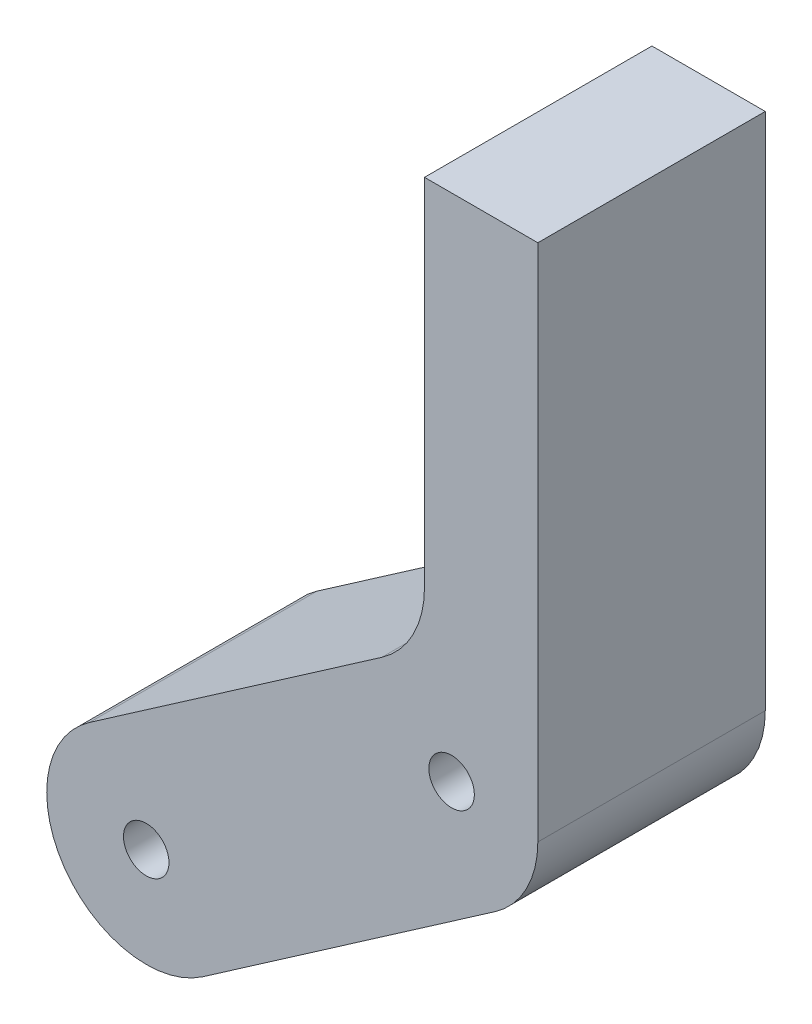
ISO-10303-21;
HEADER;
FILE_DESCRIPTION(('STEP AP214'),'2;1');
FILE_NAME('part.step','',(''),(''),'','','');
FILE_SCHEMA(('AUTOMOTIVE_DESIGN { 1 0 10303 214 1 1 1 1 }'));
ENDSEC;
DATA;
#1=APPLICATION_CONTEXT('core data for automotive mechanical design processes');
#2=APPLICATION_PROTOCOL_DEFINITION('international standard','automotive_design',2000,#1);
#3=PRODUCT_CONTEXT('',#1,'mechanical');
#4=PRODUCT('Part','Part','',(#3));
#5=PRODUCT_RELATED_PRODUCT_CATEGORY('part','',(#4));
#6=PRODUCT_DEFINITION_FORMATION('','',#4);
#7=PRODUCT_DEFINITION_CONTEXT('part definition',#1,'design');
#8=PRODUCT_DEFINITION('design','',#6,#7);
#9=PRODUCT_DEFINITION_SHAPE('','',#8);
#10=(LENGTH_UNIT() NAMED_UNIT(*) SI_UNIT(.MILLI.,.METRE.));
#11=(NAMED_UNIT(*) PLANE_ANGLE_UNIT() SI_UNIT($,.RADIAN.));
#12=(NAMED_UNIT(*) SI_UNIT($,.STERADIAN.) SOLID_ANGLE_UNIT());
#13=UNCERTAINTY_MEASURE_WITH_UNIT(LENGTH_MEASURE(1.E-05),#10,'distance_accuracy_value','');
#14=(GEOMETRIC_REPRESENTATION_CONTEXT(3) GLOBAL_UNCERTAINTY_ASSIGNED_CONTEXT((#13)) GLOBAL_UNIT_ASSIGNED_CONTEXT((#10,
#11,#12)) REPRESENTATION_CONTEXT('',''));
#15=CARTESIAN_POINT('',(0.,0.,0.));
#16=DIRECTION('',(0.,0.,1.));
#17=DIRECTION('',(1.,0.,0.));
#18=AXIS2_PLACEMENT_3D('',#15,#16,#17);
#19=CARTESIAN_POINT('',(22.2421831117619,-7.73729031980641,-11.));
#20=DIRECTION('',(1.,0.,0.));
#21=DIRECTION('',(0.,0.,-1.));
#22=AXIS2_PLACEMENT_3D('',#19,#20,#21);
#23=PLANE('',#22);
#24=DIRECTION('',(0.,1.,0.));
#25=VECTOR('',#24,1.);
#26=CARTESIAN_POINT('',(22.2421831117619,-7.73729031980641,5.));
#27=LINE('',#26,#25);
#28=CARTESIAN_POINT('',(22.2421831117619,-4.07134807252581,5.));
#29=VERTEX_POINT('',#28);
#30=CARTESIAN_POINT('',(22.2421831117619,32.4362538271655,5.));
#31=VERTEX_POINT('',#30);
#32=EDGE_CURVE('E168',#29,#31,#27,.T.);
#33=ORIENTED_EDGE('',*,*,#32,.F.);
#34=DIRECTION('',(0.,0.,1.));
#35=VECTOR('',#34,1.);
#36=CARTESIAN_POINT('',(22.2421831117619,-4.07134807252581,-11.));
#37=LINE('',#36,#35);
#38=CARTESIAN_POINT('',(22.2421831117619,-4.07134807252581,-11.));
#39=VERTEX_POINT('',#38);
#40=EDGE_CURVE('E70',#29,#39,#37,.F.);
#41=ORIENTED_EDGE('',*,*,#40,.T.);
#42=DIRECTION('',(0.,1.,0.));
#43=VECTOR('',#42,1.);
#44=CARTESIAN_POINT('',(22.2421831117619,-7.73729031980641,-11.));
#45=LINE('',#44,#43);
#46=CARTESIAN_POINT('',(22.2421831117619,32.4362538271655,-11.));
#47=VERTEX_POINT('',#46);
#48=EDGE_CURVE('E307',#39,#47,#45,.T.);
#49=ORIENTED_EDGE('',*,*,#48,.T.);
#50=DIRECTION('',(0.,0.,1.));
#51=VECTOR('',#50,1.);
#52=CARTESIAN_POINT('',(22.2421831117619,32.4362538271655,-11.));
#53=LINE('',#52,#51);
#54=EDGE_CURVE('E175',#47,#31,#53,.T.);
#55=ORIENTED_EDGE('',*,*,#54,.T.);
#56=EDGE_LOOP('',(#33,#41,#49,#55));
#57=FACE_BOUND('',#56,.T.);
#58=ADVANCED_FACE('F45',(#57),#23,.T.);
#59=CARTESIAN_POINT('',(-1.32040627832387,-24.0633622955955,-11.));
#60=DIRECTION('',(0.569528530928992,-0.821971564263548,0.));
#61=DIRECTION('',(0.821971564263548,0.569528530928992,0.));
#62=AXIS2_PLACEMENT_3D('',#59,#60,#61);
#63=PLANE('',#62);
#64=DIRECTION('',(0.821971564263548,0.569528530928992,0.));
#65=VECTOR('',#64,1.);
#66=CARTESIAN_POINT('',(-1.32040627832387,-24.0633622955955,5.));
#67=LINE('',#66,#65);
#68=CARTESIAN_POINT('',(-1.32040627832387,-24.0633622955955,5.));
#69=VERTEX_POINT('',#68);
#70=CARTESIAN_POINT('',(19.2288828282648,-9.82514902237065,5.));
#71=VERTEX_POINT('',#70);
#72=EDGE_CURVE('E62',#69,#71,#67,.T.);
#73=ORIENTED_EDGE('',*,*,#72,.F.);
#74=DIRECTION('',(0.,0.,1.));
#75=VECTOR('',#74,1.);
#76=CARTESIAN_POINT('',(-1.32040627832386,-24.0633622955955,-11.));
#77=LINE('',#76,#75);
#78=CARTESIAN_POINT('',(-1.32040627832387,-24.0633622955955,-7.));
#79=VERTEX_POINT('',#78);
#80=EDGE_CURVE('E351',#79,#69,#77,.T.);
#81=ORIENTED_EDGE('',*,*,#80,.F.);
#82=CARTESIAN_POINT('',(-1.32040627832387,-24.0633622955955,-11.));
#83=VERTEX_POINT('',#82);
#84=EDGE_CURVE('E347',#83,#79,#77,.T.);
#85=ORIENTED_EDGE('',*,*,#84,.F.);
#86=DIRECTION('',(0.821971564263548,0.569528530928992,0.));
#87=VECTOR('',#86,1.);
#88=CARTESIAN_POINT('',(-1.32040627832387,-24.0633622955955,-11.));
#89=LINE('',#88,#87);
#90=CARTESIAN_POINT('',(19.2288828282649,-9.82514902237065,-11.));
#91=VERTEX_POINT('',#90);
#92=EDGE_CURVE('E343',#83,#91,#89,.T.);
#93=ORIENTED_EDGE('',*,*,#92,.T.);
#94=DIRECTION('',(0.,0.,1.));
#95=VECTOR('',#94,1.);
#96=CARTESIAN_POINT('',(19.2288828282648,-9.82514902237065,-11.));
#97=LINE('',#96,#95);
#98=EDGE_CURVE('E182',#91,#71,#97,.T.);
#99=ORIENTED_EDGE('',*,*,#98,.T.);
#100=EDGE_LOOP('',(#73,#81,#85,#93,#99));
#101=FACE_BOUND('',#100,.T.);
#102=ADVANCED_FACE('F412',(#101),#63,.T.);
#103=CARTESIAN_POINT('',(-5.30710599482682,-18.3095613457506,-11.));
#104=DIRECTION('',(0.,0.,1.));
#105=DIRECTION('',(1.,0.,0.));
#106=AXIS2_PLACEMENT_3D('',#103,#104,#105);
#107=CYLINDRICAL_SURFACE('',#106,6.99999999999999);
#108=CARTESIAN_POINT('',(-5.30710599482682,-18.3095613457506,5.));
#109=DIRECTION('',(0.,0.,-1.));
#110=DIRECTION('',(-1.,0.,0.));
#111=AXIS2_PLACEMENT_3D('',#108,#109,#110);
#112=CIRCLE('',#111,6.99999999999999);
#113=CARTESIAN_POINT('',(-9.29380571132975,-12.5557603959058,5.));
#114=VERTEX_POINT('',#113);
#115=EDGE_CURVE('E215',#114,#69,#112,.F.);
#116=ORIENTED_EDGE('',*,*,#115,.F.);
#117=DIRECTION('',(0.,0.,1.));
#118=VECTOR('',#117,1.);
#119=CARTESIAN_POINT('',(-9.29380571132976,-12.5557603959058,-11.));
#120=LINE('',#119,#118);
#121=CARTESIAN_POINT('',(-9.29380571132976,-12.5557603959058,-11.));
#122=VERTEX_POINT('',#121);
#123=EDGE_CURVE('E352',#122,#114,#120,.T.);
#124=ORIENTED_EDGE('',*,*,#123,.F.);
#125=CARTESIAN_POINT('',(-5.30710599482682,-18.3095613457506,-11.));
#126=DIRECTION('',(0.,0.,1.));
#127=DIRECTION('',(1.,0.,0.));
#128=AXIS2_PLACEMENT_3D('',#125,#126,#127);
#129=CIRCLE('',#128,6.99999999999999);
#130=CARTESIAN_POINT('',(-12.3071059948268,-18.3095613457506,-11.));
#131=VERTEX_POINT('',#130);
#132=EDGE_CURVE('E339',#122,#131,#129,.T.);
#133=ORIENTED_EDGE('',*,*,#132,.T.);
#134=DIRECTION('',(0.,0.,-1.));
#135=VECTOR('',#134,1.);
#136=CARTESIAN_POINT('',(-12.3071059948268,-18.3095613457506,-7.));
#137=LINE('',#136,#135);
#138=CARTESIAN_POINT('',(-12.3071059948268,-18.3095613457506,-7.));
#139=VERTEX_POINT('',#138);
#140=EDGE_CURVE('E308',#139,#131,#137,.T.);
#141=ORIENTED_EDGE('',*,*,#140,.F.);
#142=CARTESIAN_POINT('',(-5.30710599482682,-18.3095613457506,-7.));
#143=DIRECTION('',(0.,0.,-1.));
#144=DIRECTION('',(-1.,0.,0.));
#145=AXIS2_PLACEMENT_3D('',#142,#143,#144);
#146=CIRCLE('',#145,7.00000000000001);
#147=EDGE_CURVE('E272',#79,#139,#146,.T.);
#148=ORIENTED_EDGE('',*,*,#147,.F.);
#149=ORIENTED_EDGE('',*,*,#80,.T.);
#150=EDGE_LOOP('',(#116,#124,#133,#141,#148,#149));
#151=FACE_BOUND('',#150,.T.);
#152=ADVANCED_FACE('F389',(#151),#107,.T.);
#153=CARTESIAN_POINT('',(14.2687836787583,3.77031157988488,-11.));
#154=DIRECTION('',(-0.569528530928993,0.821971564263548,0.));
#155=DIRECTION('',(-0.821971564263548,-0.569528530928993,0.));
#156=AXIS2_PLACEMENT_3D('',#153,#154,#155);
#157=PLANE('',#156);
#158=DIRECTION('',(-0.821971564263548,-0.569528530928993,0.));
#159=VECTOR('',#158,1.);
#160=CARTESIAN_POINT('',(14.2687836787583,3.77031157988488,5.));
#161=LINE('',#160,#159);
#162=CARTESIAN_POINT('',(11.2554833952613,1.68245287732064,5.));
#163=VERTEX_POINT('',#162);
#164=EDGE_CURVE('E222',#163,#114,#161,.T.);
#165=ORIENTED_EDGE('',*,*,#164,.F.);
#166=DIRECTION('',(0.,0.,1.));
#167=VECTOR('',#166,1.);
#168=CARTESIAN_POINT('',(11.2554833952613,1.68245287732064,-11.));
#169=LINE('',#168,#167);
#170=CARTESIAN_POINT('',(11.2554833952613,1.68245287732064,-11.));
#171=VERTEX_POINT('',#170);
#172=EDGE_CURVE('E187',#163,#171,#169,.F.);
#173=ORIENTED_EDGE('',*,*,#172,.T.);
#174=DIRECTION('',(-0.821971564263548,-0.569528530928993,0.));
#175=VECTOR('',#174,1.);
#176=CARTESIAN_POINT('',(14.2687836787583,3.77031157988488,-11.));
#177=LINE('',#176,#175);
#178=EDGE_CURVE('E336',#171,#122,#177,.T.);
#179=ORIENTED_EDGE('',*,*,#178,.T.);
#180=ORIENTED_EDGE('',*,*,#123,.T.);
#181=EDGE_LOOP('',(#165,#173,#179,#180));
#182=FACE_BOUND('',#181,.T.);
#183=ADVANCED_FACE('F369',(#182),#157,.T.);
#184=CARTESIAN_POINT('',(14.2687836787583,32.4362538271655,-11.));
#185=DIRECTION('',(-1.,0.,0.));
#186=DIRECTION('',(0.,0.,1.));
#187=AXIS2_PLACEMENT_3D('',#184,#185,#186);
#188=PLANE('',#187);
#189=DIRECTION('',(0.,-1.,0.));
#190=VECTOR('',#189,1.);
#191=CARTESIAN_POINT('',(14.2687836787583,32.4362538271655,5.));
#192=LINE('',#191,#190);
#193=CARTESIAN_POINT('',(14.2687836787583,32.4362538271655,5.));
#194=VERTEX_POINT('',#193);
#195=CARTESIAN_POINT('',(14.2687836787583,7.43625382716548,5.));
#196=VERTEX_POINT('',#195);
#197=EDGE_CURVE('E212',#194,#196,#192,.T.);
#198=ORIENTED_EDGE('',*,*,#197,.F.);
#199=DIRECTION('',(0.,0.,1.));
#200=VECTOR('',#199,1.);
#201=CARTESIAN_POINT('',(14.2687836787583,32.4362538271655,-11.));
#202=LINE('',#201,#200);
#203=CARTESIAN_POINT('',(14.2687836787583,32.4362538271655,-11.));
#204=VERTEX_POINT('',#203);
#205=EDGE_CURVE('E356',#204,#194,#202,.T.);
#206=ORIENTED_EDGE('',*,*,#205,.F.);
#207=DIRECTION('',(0.,-1.,0.));
#208=VECTOR('',#207,1.);
#209=CARTESIAN_POINT('',(14.2687836787583,32.4362538271655,-11.));
#210=LINE('',#209,#208);
#211=CARTESIAN_POINT('',(14.2687836787583,7.43625382716548,-11.));
#212=VERTEX_POINT('',#211);
#213=EDGE_CURVE('E332',#204,#212,#210,.T.);
#214=ORIENTED_EDGE('',*,*,#213,.T.);
#215=DIRECTION('',(0.,0.,1.));
#216=VECTOR('',#215,1.);
#217=CARTESIAN_POINT('',(14.2687836787583,7.43625382716548,11.));
#218=LINE('',#217,#216);
#219=EDGE_CURVE('E350',#212,#196,#218,.T.);
#220=ORIENTED_EDGE('',*,*,#219,.T.);
#221=EDGE_LOOP('',(#198,#206,#214,#220));
#222=FACE_BOUND('',#221,.T.);
#223=ADVANCED_FACE('F382',(#222),#188,.T.);
#224=CARTESIAN_POINT('',(22.2421831117619,32.4362538271655,-11.));
#225=DIRECTION('',(0.,1.,0.));
#226=DIRECTION('',(0.,0.,1.));
#227=AXIS2_PLACEMENT_3D('',#224,#225,#226);
#228=PLANE('',#227);
#229=DIRECTION('',(-1.,0.,0.));
#230=VECTOR('',#229,1.);
#231=CARTESIAN_POINT('',(22.2421831117619,32.4362538271655,5.));
#232=LINE('',#231,#230);
#233=EDGE_CURVE('E177',#31,#194,#232,.T.);
#234=ORIENTED_EDGE('',*,*,#233,.F.);
#235=ORIENTED_EDGE('',*,*,#54,.F.);
#236=DIRECTION('',(-1.,0.,0.));
#237=VECTOR('',#236,1.);
#238=CARTESIAN_POINT('',(22.2421831117619,32.4362538271655,-11.));
#239=LINE('',#238,#237);
#240=EDGE_CURVE('E328',#47,#204,#239,.T.);
#241=ORIENTED_EDGE('',*,*,#240,.T.);
#242=ORIENTED_EDGE('',*,*,#205,.T.);
#243=EDGE_LOOP('',(#234,#235,#241,#242));
#244=FACE_BOUND('',#243,.T.);
#245=ADVANCED_FACE('F385',(#244),#228,.T.);
#246=CARTESIAN_POINT('',(-5.30710599482682,-18.3095613457506,-11.));
#247=DIRECTION('',(0.,0.,1.));
#248=DIRECTION('',(1.,0.,0.));
#249=AXIS2_PLACEMENT_3D('',#246,#247,#248);
#250=PLANE('',#249);
#251=CARTESIAN_POINT('',(16.1749990400533,-3.42501758085857,-11.));
#252=DIRECTION('',(0.,0.,1.));
#253=DIRECTION('',(1.,0.,0.));
#254=AXIS2_PLACEMENT_3D('',#251,#252,#253);
#255=CIRCLE('',#254,1.6);
#256=CARTESIAN_POINT('',(17.7749990400533,-3.42501758085857,-11.));
#257=VERTEX_POINT('',#256);
#258=EDGE_CURVE('E196',#257,#257,#255,.T.);
#259=ORIENTED_EDGE('',*,*,#258,.T.);
#260=EDGE_LOOP('',(#259));
#261=FACE_BOUND('',#260,.T.);
#262=ORIENTED_EDGE('',*,*,#48,.F.);
#263=CARTESIAN_POINT('',(15.2421831117619,-4.07134807252581,-11.));
#264=DIRECTION('',(0.,0.,1.));
#265=DIRECTION('',(1.,0.,0.));
#266=AXIS2_PLACEMENT_3D('',#263,#264,#265);
#267=CIRCLE('',#266,7.);
#268=EDGE_CURVE('E180',#39,#91,#267,.F.);
#269=ORIENTED_EDGE('',*,*,#268,.T.);
#270=ORIENTED_EDGE('',*,*,#92,.F.);
#271=DIRECTION('',(0.569528530928992,-0.821971564263548,0.));
#272=VECTOR('',#271,1.);
#273=CARTESIAN_POINT('',(-3.02899187111085,-21.5974476028048,-11.));
#274=LINE('',#273,#272);
#275=CARTESIAN_POINT('',(-3.02899187111084,-21.5974476028049,-11.));
#276=VERTEX_POINT('',#275);
#277=EDGE_CURVE('E298',#276,#83,#274,.T.);
#278=ORIENTED_EDGE('',*,*,#277,.F.);
#279=CARTESIAN_POINT('',(-5.30710599482682,-18.3095613457506,-11.));
#280=DIRECTION('',(0.,0.,-1.));
#281=DIRECTION('',(-1.,0.,0.));
#282=AXIS2_PLACEMENT_3D('',#279,#280,#281);
#283=CIRCLE('',#282,4.00000000000001);
#284=CARTESIAN_POINT('',(-3.20697075395605,-14.9052358662977,-11.));
#285=VERTEX_POINT('',#284);
#286=EDGE_CURVE('E294',#285,#276,#283,.T.);
#287=ORIENTED_EDGE('',*,*,#286,.F.);
#288=DIRECTION('',(-0.941780242902148,-0.336229050022706,0.));
#289=VECTOR('',#288,1.);
#290=CARTESIAN_POINT('',(11.878198097342,-9.51961429424793,-11.));
#291=LINE('',#290,#289);
#292=CARTESIAN_POINT('',(11.878198097342,-9.51961429424793,-11.));
#293=VERTEX_POINT('',#292);
#294=EDGE_CURVE('E290',#293,#285,#291,.T.);
#295=ORIENTED_EDGE('',*,*,#294,.F.);
#296=DIRECTION('',(0.3362290500227,-0.94178024290215,0.));
#297=VECTOR('',#296,1.);
#298=CARTESIAN_POINT('',(11.3738545223079,-8.10694392989473,-11.));
#299=LINE('',#298,#297);
#300=CARTESIAN_POINT('',(11.3738545223079,-8.10694392989473,-11.));
#301=VERTEX_POINT('',#300);
#302=EDGE_CURVE('E286',#301,#293,#299,.T.);
#303=ORIENTED_EDGE('',*,*,#302,.F.);
#304=DIRECTION('',(0.941780242902148,0.336229050022705,0.));
#305=VECTOR('',#304,1.);
#306=CARTESIAN_POINT('',(-6.65202219491764,-14.542440374142,-11.));
#307=LINE('',#306,#305);
#308=CARTESIAN_POINT('',(-6.65202219491764,-14.542440374142,-11.));
#309=VERTEX_POINT('',#308);
#310=EDGE_CURVE('E282',#309,#301,#307,.T.);
#311=ORIENTED_EDGE('',*,*,#310,.F.);
#312=CARTESIAN_POINT('',(-5.30710599482682,-18.3095613457506,-11.));
#313=DIRECTION('',(0.,0.,-1.));
#314=DIRECTION('',(-1.,0.,0.));
#315=AXIS2_PLACEMENT_3D('',#312,#313,#314);
#316=CIRCLE('',#315,4.00000000000001);
#317=CARTESIAN_POINT('',(-9.30710599482682,-18.3095613457506,-11.));
#318=VERTEX_POINT('',#317);
#319=EDGE_CURVE('E249',#318,#309,#316,.T.);
#320=ORIENTED_EDGE('',*,*,#319,.F.);
#321=DIRECTION('',(1.,0.,0.));
#322=VECTOR('',#321,1.);
#323=CARTESIAN_POINT('',(-12.3071059948268,-18.3095613457506,-11.));
#324=LINE('',#323,#322);
#325=EDGE_CURVE('E257',#131,#318,#324,.T.);
#326=ORIENTED_EDGE('',*,*,#325,.F.);
#327=ORIENTED_EDGE('',*,*,#132,.F.);
#328=ORIENTED_EDGE('',*,*,#178,.F.);
#329=CARTESIAN_POINT('',(7.26878367875832,7.43625382716548,-11.));
#330=DIRECTION('',(0.,0.,1.));
#331=DIRECTION('',(1.,0.,0.));
#332=AXIS2_PLACEMENT_3D('',#329,#330,#331);
#333=CIRCLE('',#332,7.);
#334=EDGE_CURVE('E55',#171,#212,#333,.T.);
#335=ORIENTED_EDGE('',*,*,#334,.T.);
#336=ORIENTED_EDGE('',*,*,#213,.F.);
#337=ORIENTED_EDGE('',*,*,#240,.F.);
#338=EDGE_LOOP('',(#262,#269,#270,#278,#287,#295,#303,#311,#320,#326,#327,#328,#335,#336,#337));
#339=FACE_BOUND('',#338,.T.);
#340=ADVANCED_FACE('F375',(#261,#339),#250,.F.);
#341=CARTESIAN_POINT('',(-5.30710599482682,-18.3095613457506,-7.));
#342=DIRECTION('',(0.,0.,-1.));
#343=DIRECTION('',(-1.,0.,0.));
#344=AXIS2_PLACEMENT_3D('',#341,#342,#343);
#345=CYLINDRICAL_SURFACE('',#344,4.00000000000001);
#346=ORIENTED_EDGE('',*,*,#319,.T.);
#347=DIRECTION('',(0.,0.,-1.));
#348=VECTOR('',#347,1.);
#349=CARTESIAN_POINT('',(-6.65202219491764,-14.542440374142,-7.));
#350=LINE('',#349,#348);
#351=CARTESIAN_POINT('',(-6.65202219491764,-14.542440374142,-7.));
#352=VERTEX_POINT('',#351);
#353=EDGE_CURVE('E279',#352,#309,#350,.T.);
#354=ORIENTED_EDGE('',*,*,#353,.F.);
#355=CARTESIAN_POINT('',(-5.30710599482682,-18.3095613457506,-7.));
#356=DIRECTION('',(0.,0.,-1.));
#357=DIRECTION('',(-1.,0.,0.));
#358=AXIS2_PLACEMENT_3D('',#355,#356,#357);
#359=CIRCLE('',#358,4.00000000000001);
#360=CARTESIAN_POINT('',(-9.30710599482682,-18.3095613457506,-7.));
#361=VERTEX_POINT('',#360);
#362=EDGE_CURVE('E252',#361,#352,#359,.T.);
#363=ORIENTED_EDGE('',*,*,#362,.F.);
#364=DIRECTION('',(0.,0.,-1.));
#365=VECTOR('',#364,1.);
#366=CARTESIAN_POINT('',(-9.30710599482682,-18.3095613457506,-7.));
#367=LINE('',#366,#365);
#368=EDGE_CURVE('E304',#361,#318,#367,.T.);
#369=ORIENTED_EDGE('',*,*,#368,.T.);
#370=EDGE_LOOP('',(#346,#354,#363,#369));
#371=FACE_BOUND('',#370,.T.);
#372=ADVANCED_FACE('F446',(#371),#345,.F.);
#373=CARTESIAN_POINT('',(-12.3071059948268,-18.3095613457506,-7.));
#374=DIRECTION('',(0.,1.,0.));
#375=DIRECTION('',(0.,0.,1.));
#376=AXIS2_PLACEMENT_3D('',#373,#374,#375);
#377=PLANE('',#376);
#378=ORIENTED_EDGE('',*,*,#325,.T.);
#379=ORIENTED_EDGE('',*,*,#368,.F.);
#380=DIRECTION('',(1.,0.,0.));
#381=VECTOR('',#380,1.);
#382=CARTESIAN_POINT('',(-12.3071059948268,-18.3095613457506,-7.));
#383=LINE('',#382,#381);
#384=EDGE_CURVE('E275',#139,#361,#383,.T.);
#385=ORIENTED_EDGE('',*,*,#384,.F.);
#386=ORIENTED_EDGE('',*,*,#140,.T.);
#387=EDGE_LOOP('',(#378,#379,#385,#386));
#388=FACE_BOUND('',#387,.T.);
#389=ADVANCED_FACE('F442',(#388),#377,.F.);
#390=CARTESIAN_POINT('',(-3.02899187111085,-21.5974476028048,-7.));
#391=DIRECTION('',(0.821971564263548,0.569528530928992,0.));
#392=DIRECTION('',(-0.569528530928992,0.821971564263548,0.));
#393=AXIS2_PLACEMENT_3D('',#390,#391,#392);
#394=PLANE('',#393);
#395=ORIENTED_EDGE('',*,*,#277,.T.);
#396=ORIENTED_EDGE('',*,*,#84,.T.);
#397=DIRECTION('',(0.569528530928992,-0.821971564263548,0.));
#398=VECTOR('',#397,1.);
#399=CARTESIAN_POINT('',(-3.02899187111085,-21.5974476028048,-7.));
#400=LINE('',#399,#398);
#401=CARTESIAN_POINT('',(-3.02899187111084,-21.5974476028049,-7.));
#402=VERTEX_POINT('',#401);
#403=EDGE_CURVE('E268',#402,#79,#400,.T.);
#404=ORIENTED_EDGE('',*,*,#403,.F.);
#405=DIRECTION('',(0.,0.,-1.));
#406=VECTOR('',#405,1.);
#407=CARTESIAN_POINT('',(-3.02899187111084,-21.5974476028049,-7.));
#408=LINE('',#407,#406);
#409=EDGE_CURVE('E311',#402,#276,#408,.T.);
#410=ORIENTED_EDGE('',*,*,#409,.T.);
#411=EDGE_LOOP('',(#395,#396,#404,#410));
#412=FACE_BOUND('',#411,.T.);
#413=ADVANCED_FACE('F445',(#412),#394,.F.);
#414=CARTESIAN_POINT('',(-5.30710599482682,-18.3095613457506,-7.));
#415=DIRECTION('',(0.,0.,-1.));
#416=DIRECTION('',(-1.,0.,0.));
#417=AXIS2_PLACEMENT_3D('',#414,#415,#416);
#418=CYLINDRICAL_SURFACE('',#417,4.00000000000001);
#419=ORIENTED_EDGE('',*,*,#286,.T.);
#420=ORIENTED_EDGE('',*,*,#409,.F.);
#421=CARTESIAN_POINT('',(-5.30710599482682,-18.3095613457506,-7.));
#422=DIRECTION('',(0.,0.,-1.));
#423=DIRECTION('',(-1.,0.,0.));
#424=AXIS2_PLACEMENT_3D('',#421,#422,#423);
#425=CIRCLE('',#424,4.00000000000001);
#426=CARTESIAN_POINT('',(-3.20697075395605,-14.9052358662977,-7.));
#427=VERTEX_POINT('',#426);
#428=EDGE_CURVE('E264',#427,#402,#425,.T.);
#429=ORIENTED_EDGE('',*,*,#428,.F.);
#430=DIRECTION('',(0.,0.,-1.));
#431=VECTOR('',#430,1.);
#432=CARTESIAN_POINT('',(-3.20697075395605,-14.9052358662977,-7.));
#433=LINE('',#432,#431);
#434=EDGE_CURVE('E314',#427,#285,#433,.T.);
#435=ORIENTED_EDGE('',*,*,#434,.T.);
#436=EDGE_LOOP('',(#419,#420,#429,#435));
#437=FACE_BOUND('',#436,.T.);
#438=ADVANCED_FACE('F450',(#437),#418,.F.);
#439=CARTESIAN_POINT('',(11.878198097342,-9.51961429424793,-7.));
#440=DIRECTION('',(0.336229050022706,-0.941780242902148,0.));
#441=DIRECTION('',(0.941780242902148,0.336229050022706,0.));
#442=AXIS2_PLACEMENT_3D('',#439,#440,#441);
#443=PLANE('',#442);
#444=ORIENTED_EDGE('',*,*,#294,.T.);
#445=ORIENTED_EDGE('',*,*,#434,.F.);
#446=DIRECTION('',(-0.941780242902148,-0.336229050022706,0.));
#447=VECTOR('',#446,1.);
#448=CARTESIAN_POINT('',(11.878198097342,-9.51961429424793,-7.));
#449=LINE('',#448,#447);
#450=CARTESIAN_POINT('',(16.5870993118527,-7.83846904413444,-7.));
#451=VERTEX_POINT('',#450);
#452=EDGE_CURVE('E260',#451,#427,#449,.T.);
#453=ORIENTED_EDGE('',*,*,#452,.F.);
#454=DIRECTION('',(0.,0.,1.));
#455=VECTOR('',#454,1.);
#456=CARTESIAN_POINT('',(16.5870993118527,-7.83846904413444,-9.));
#457=LINE('',#456,#455);
#458=CARTESIAN_POINT('',(16.5870993118527,-7.83846904413444,-9.));
#459=VERTEX_POINT('',#458);
#460=EDGE_CURVE('E230',#459,#451,#457,.T.);
#461=ORIENTED_EDGE('',*,*,#460,.F.);
#462=DIRECTION('',(-0.94178024290215,-0.3362290500227,0.));
#463=VECTOR('',#462,1.);
#464=CARTESIAN_POINT('',(16.5870993118527,-7.83846904413444,-9.));
#465=LINE('',#464,#463);
#466=CARTESIAN_POINT('',(11.878198097342,-9.51961429424794,-9.));
#467=VERTEX_POINT('',#466);
#468=EDGE_CURVE('E242',#459,#467,#465,.T.);
#469=ORIENTED_EDGE('',*,*,#468,.T.);
#470=DIRECTION('',(0.,0.,-1.));
#471=VECTOR('',#470,1.);
#472=CARTESIAN_POINT('',(11.878198097342,-9.51961429424793,-7.));
#473=LINE('',#472,#471);
#474=EDGE_CURVE('E317',#467,#293,#473,.T.);
#475=ORIENTED_EDGE('',*,*,#474,.T.);
#476=EDGE_LOOP('',(#444,#445,#453,#461,#469,#475));
#477=FACE_BOUND('',#476,.T.);
#478=ADVANCED_FACE('F454',(#477),#443,.F.);
#479=CARTESIAN_POINT('',(11.3738545223079,-8.10694392989473,-7.));
#480=DIRECTION('',(0.94178024290215,0.3362290500227,0.));
#481=DIRECTION('',(-0.3362290500227,0.94178024290215,0.));
#482=AXIS2_PLACEMENT_3D('',#479,#480,#481);
#483=PLANE('',#482);
#484=ORIENTED_EDGE('',*,*,#474,.F.);
#485=DIRECTION('',(0.336229050022701,-0.94178024290215,0.));
#486=VECTOR('',#485,1.);
#487=CARTESIAN_POINT('',(11.3738545223079,-8.10694392989473,-9.));
#488=LINE('',#487,#486);
#489=CARTESIAN_POINT('',(11.3738545223079,-8.10694392989473,-9.));
#490=VERTEX_POINT('',#489);
#491=EDGE_CURVE('E225',#490,#467,#488,.T.);
#492=ORIENTED_EDGE('',*,*,#491,.F.);
#493=DIRECTION('',(0.,0.,-1.));
#494=VECTOR('',#493,1.);
#495=CARTESIAN_POINT('',(11.3738545223079,-8.10694392989473,-7.));
#496=LINE('',#495,#494);
#497=EDGE_CURVE('E320',#490,#301,#496,.T.);
#498=ORIENTED_EDGE('',*,*,#497,.T.);
#499=ORIENTED_EDGE('',*,*,#302,.T.);
#500=EDGE_LOOP('',(#484,#492,#498,#499));
#501=FACE_BOUND('',#500,.T.);
#502=ADVANCED_FACE('F458',(#501),#483,.F.);
#503=CARTESIAN_POINT('',(-6.65202219491764,-14.542440374142,-7.));
#504=DIRECTION('',(-0.336229050022705,0.941780242902148,0.));
#505=DIRECTION('',(-0.941780242902148,-0.336229050022705,0.));
#506=AXIS2_PLACEMENT_3D('',#503,#504,#505);
#507=PLANE('',#506);
#508=ORIENTED_EDGE('',*,*,#310,.T.);
#509=ORIENTED_EDGE('',*,*,#497,.F.);
#510=DIRECTION('',(-0.94178024290215,-0.3362290500227,0.));
#511=VECTOR('',#510,1.);
#512=CARTESIAN_POINT('',(16.0827557368187,-6.42579867978123,-9.));
#513=LINE('',#512,#511);
#514=CARTESIAN_POINT('',(16.0827557368187,-6.42579867978123,-9.));
#515=VERTEX_POINT('',#514);
#516=EDGE_CURVE('E246',#515,#490,#513,.T.);
#517=ORIENTED_EDGE('',*,*,#516,.F.);
#518=DIRECTION('',(0.,0.,-1.));
#519=VECTOR('',#518,1.);
#520=CARTESIAN_POINT('',(16.0827557368187,-6.42579867978123,-7.));
#521=LINE('',#520,#519);
#522=CARTESIAN_POINT('',(16.0827557368187,-6.42579867978123,-7.));
#523=VERTEX_POINT('',#522);
#524=EDGE_CURVE('E238',#523,#515,#521,.T.);
#525=ORIENTED_EDGE('',*,*,#524,.F.);
#526=DIRECTION('',(0.941780242902148,0.336229050022705,0.));
#527=VECTOR('',#526,1.);
#528=CARTESIAN_POINT('',(-6.65202219491764,-14.542440374142,-7.));
#529=LINE('',#528,#527);
#530=EDGE_CURVE('E256',#352,#523,#529,.T.);
#531=ORIENTED_EDGE('',*,*,#530,.F.);
#532=ORIENTED_EDGE('',*,*,#353,.T.);
#533=EDGE_LOOP('',(#508,#509,#517,#525,#531,#532));
#534=FACE_BOUND('',#533,.T.);
#535=ADVANCED_FACE('F440',(#534),#507,.F.);
#536=CARTESIAN_POINT('',(-5.30710599482682,-18.3095613457506,-7.));
#537=DIRECTION('',(0.,0.,-1.));
#538=DIRECTION('',(-1.,0.,0.));
#539=AXIS2_PLACEMENT_3D('',#536,#537,#538);
#540=PLANE('',#539);
#541=CARTESIAN_POINT('',(-5.30710599482682,-18.3095613457506,-7.));
#542=DIRECTION('',(0.,0.,-1.));
#543=DIRECTION('',(-1.,0.,0.));
#544=AXIS2_PLACEMENT_3D('',#541,#542,#543);
#545=CIRCLE('',#544,1.6);
#546=CARTESIAN_POINT('',(-6.90710599482682,-18.3095613457506,-7.));
#547=VERTEX_POINT('',#546);
#548=EDGE_CURVE('E195',#547,#547,#545,.T.);
#549=ORIENTED_EDGE('',*,*,#548,.F.);
#550=EDGE_LOOP('',(#549));
#551=FACE_BOUND('',#550,.T.);
#552=ORIENTED_EDGE('',*,*,#362,.T.);
#553=ORIENTED_EDGE('',*,*,#530,.T.);
#554=DIRECTION('',(-0.336229050022701,0.94178024290215,0.));
#555=VECTOR('',#554,1.);
#556=CARTESIAN_POINT('',(16.5870993118527,-7.83846904413444,-7.));
#557=LINE('',#556,#555);
#558=EDGE_CURVE('E234',#451,#523,#557,.T.);
#559=ORIENTED_EDGE('',*,*,#558,.F.);
#560=ORIENTED_EDGE('',*,*,#452,.T.);
#561=ORIENTED_EDGE('',*,*,#428,.T.);
#562=ORIENTED_EDGE('',*,*,#403,.T.);
#563=ORIENTED_EDGE('',*,*,#147,.T.);
#564=ORIENTED_EDGE('',*,*,#384,.T.);
#565=EDGE_LOOP('',(#552,#553,#559,#560,#561,#562,#563,#564));
#566=FACE_BOUND('',#565,.T.);
#567=ADVANCED_FACE('F433',(#551,#566),#540,.T.);
#568=CARTESIAN_POINT('',(16.0827557368187,-6.42579867978123,-9.));
#569=DIRECTION('',(0.,0.,-1.));
#570=DIRECTION('',(-1.,0.,0.));
#571=AXIS2_PLACEMENT_3D('',#568,#569,#570);
#572=PLANE('',#571);
#573=ORIENTED_EDGE('',*,*,#491,.T.);
#574=ORIENTED_EDGE('',*,*,#468,.F.);
#575=DIRECTION('',(0.336229050022701,-0.94178024290215,0.));
#576=VECTOR('',#575,1.);
#577=CARTESIAN_POINT('',(16.0827557368187,-6.42579867978123,-9.));
#578=LINE('',#577,#576);
#579=EDGE_CURVE('E226',#515,#459,#578,.T.);
#580=ORIENTED_EDGE('',*,*,#579,.F.);
#581=ORIENTED_EDGE('',*,*,#516,.T.);
#582=EDGE_LOOP('',(#573,#574,#580,#581));
#583=FACE_BOUND('',#582,.T.);
#584=ADVANCED_FACE('F427',(#583),#572,.F.);
#585=CARTESIAN_POINT('',(12.2298465567237,4.36623057308905,0.));
#586=DIRECTION('',(-0.94178024290215,-0.336229050022701,0.));
#587=DIRECTION('',(0.336229050022701,-0.94178024290215,0.));
#588=AXIS2_PLACEMENT_3D('',#585,#586,#587);
#589=PLANE('',#588);
#590=ORIENTED_EDGE('',*,*,#579,.T.);
#591=ORIENTED_EDGE('',*,*,#460,.T.);
#592=ORIENTED_EDGE('',*,*,#558,.T.);
#593=ORIENTED_EDGE('',*,*,#524,.T.);
#594=EDGE_LOOP('',(#590,#591,#592,#593));
#595=FACE_BOUND('',#594,.T.);
#596=ADVANCED_FACE('F422',(#595),#589,.T.);
#597=CARTESIAN_POINT('',(7.26878367875832,7.43625382716548,-11.));
#598=DIRECTION('',(0.,0.,-1.));
#599=DIRECTION('',(-1.,0.,0.));
#600=AXIS2_PLACEMENT_3D('',#597,#598,#599);
#601=CYLINDRICAL_SURFACE('',#600,7.);
#602=ORIENTED_EDGE('',*,*,#172,.F.);
#603=CARTESIAN_POINT('',(7.26878367875832,7.43625382716548,5.));
#604=DIRECTION('',(0.,0.,-1.));
#605=DIRECTION('',(-1.,0.,0.));
#606=AXIS2_PLACEMENT_3D('',#603,#604,#605);
#607=CIRCLE('',#606,7.);
#608=EDGE_CURVE('E218',#163,#196,#607,.F.);
#609=ORIENTED_EDGE('',*,*,#608,.T.);
#610=ORIENTED_EDGE('',*,*,#219,.F.);
#611=ORIENTED_EDGE('',*,*,#334,.F.);
#612=EDGE_LOOP('',(#602,#609,#610,#611));
#613=FACE_BOUND('',#612,.T.);
#614=ADVANCED_FACE('F379',(#613),#601,.F.);
#615=CARTESIAN_POINT('',(15.2421831117619,-4.07134807252581,-11.));
#616=DIRECTION('',(0.,0.,1.));
#617=DIRECTION('',(1.,0.,0.));
#618=AXIS2_PLACEMENT_3D('',#615,#616,#617);
#619=CYLINDRICAL_SURFACE('',#618,7.);
#620=CARTESIAN_POINT('',(15.2421831117619,-4.07134807252581,5.));
#621=DIRECTION('',(0.,0.,-1.));
#622=DIRECTION('',(-1.,0.,0.));
#623=AXIS2_PLACEMENT_3D('',#620,#621,#622);
#624=CIRCLE('',#623,7.);
#625=EDGE_CURVE('E11',#71,#29,#624,.F.);
#626=ORIENTED_EDGE('',*,*,#625,.F.);
#627=ORIENTED_EDGE('',*,*,#98,.F.);
#628=ORIENTED_EDGE('',*,*,#268,.F.);
#629=ORIENTED_EDGE('',*,*,#40,.F.);
#630=EDGE_LOOP('',(#626,#627,#628,#629));
#631=FACE_BOUND('',#630,.T.);
#632=ADVANCED_FACE('F47',(#631),#619,.T.);
#633=CARTESIAN_POINT('',(-39.0440409139278,13.9107379479601,5.));
#634=DIRECTION('',(0.,0.,-1.));
#635=DIRECTION('',(-1.,0.,0.));
#636=AXIS2_PLACEMENT_3D('',#633,#634,#635);
#637=PLANE('',#636);
#638=CARTESIAN_POINT('',(16.1749990400533,-3.42501758085857,5.));
#639=DIRECTION('',(0.,0.,-1.));
#640=DIRECTION('',(-1.,0.,0.));
#641=AXIS2_PLACEMENT_3D('',#638,#639,#640);
#642=CIRCLE('',#641,1.6);
#643=CARTESIAN_POINT('',(14.5749990400533,-3.42501758085857,5.));
#644=VERTEX_POINT('',#643);
#645=EDGE_CURVE('E49',#644,#644,#642,.T.);
#646=ORIENTED_EDGE('',*,*,#645,.T.);
#647=EDGE_LOOP('',(#646));
#648=FACE_BOUND('',#647,.T.);
#649=CARTESIAN_POINT('',(-5.30710599482682,-18.3095613457506,5.));
#650=DIRECTION('',(0.,0.,-1.));
#651=DIRECTION('',(-1.,0.,0.));
#652=AXIS2_PLACEMENT_3D('',#649,#650,#651);
#653=CIRCLE('',#652,1.6);
#654=CARTESIAN_POINT('',(-6.90710599482682,-18.3095613457506,5.));
#655=VERTEX_POINT('',#654);
#656=EDGE_CURVE('E192',#655,#655,#653,.T.);
#657=ORIENTED_EDGE('',*,*,#656,.T.);
#658=EDGE_LOOP('',(#657));
#659=FACE_BOUND('',#658,.T.);
#660=ORIENTED_EDGE('',*,*,#164,.T.);
#661=ORIENTED_EDGE('',*,*,#115,.T.);
#662=ORIENTED_EDGE('',*,*,#72,.T.);
#663=ORIENTED_EDGE('',*,*,#625,.T.);
#664=ORIENTED_EDGE('',*,*,#32,.T.);
#665=ORIENTED_EDGE('',*,*,#233,.T.);
#666=ORIENTED_EDGE('',*,*,#197,.T.);
#667=ORIENTED_EDGE('',*,*,#608,.F.);
#668=EDGE_LOOP('',(#660,#661,#662,#663,#664,#665,#666,#667));
#669=FACE_BOUND('',#668,.T.);
#670=ADVANCED_FACE('F167',(#648,#659,#669),#637,.F.);
#671=CARTESIAN_POINT('',(-5.30710599482682,-18.3095613457506,-11.));
#672=DIRECTION('',(0.,0.,1.));
#673=DIRECTION('',(1.,0.,0.));
#674=AXIS2_PLACEMENT_3D('',#671,#672,#673);
#675=CYLINDRICAL_SURFACE('',#674,1.6);
#676=ORIENTED_EDGE('',*,*,#548,.T.);
#677=EDGE_LOOP('',(#676));
#678=FACE_BOUND('',#677,.T.);
#679=ORIENTED_EDGE('',*,*,#656,.F.);
#680=EDGE_LOOP('',(#679));
#681=FACE_BOUND('',#680,.T.);
#682=ADVANCED_FACE('F403',(#678,#681),#675,.F.);
#683=CARTESIAN_POINT('',(16.1749990400533,-3.42501758085857,-11.));
#684=DIRECTION('',(0.,0.,1.));
#685=DIRECTION('',(1.,0.,0.));
#686=AXIS2_PLACEMENT_3D('',#683,#684,#685);
#687=CYLINDRICAL_SURFACE('',#686,1.6);
#688=ORIENTED_EDGE('',*,*,#258,.F.);
#689=EDGE_LOOP('',(#688));
#690=FACE_BOUND('',#689,.T.);
#691=ORIENTED_EDGE('',*,*,#645,.F.);
#692=EDGE_LOOP('',(#691));
#693=FACE_BOUND('',#692,.T.);
#694=ADVANCED_FACE('F401',(#690,#693),#687,.F.);
#695=CLOSED_SHELL('',(#58,#102,#152,#183,#223,#245,#340,#372,#389,#413,#438,#478,#502,#535,#567,
#584,#596,#614,#632,#670,#682,#694));
#696=MANIFOLD_SOLID_BREP('B2',#695);
#697=ADVANCED_BREP_SHAPE_REPRESENTATION('',(#18,#696),#14);
#698=SHAPE_DEFINITION_REPRESENTATION(#9,#697);
ENDSEC;
END-ISO-10303-21;
